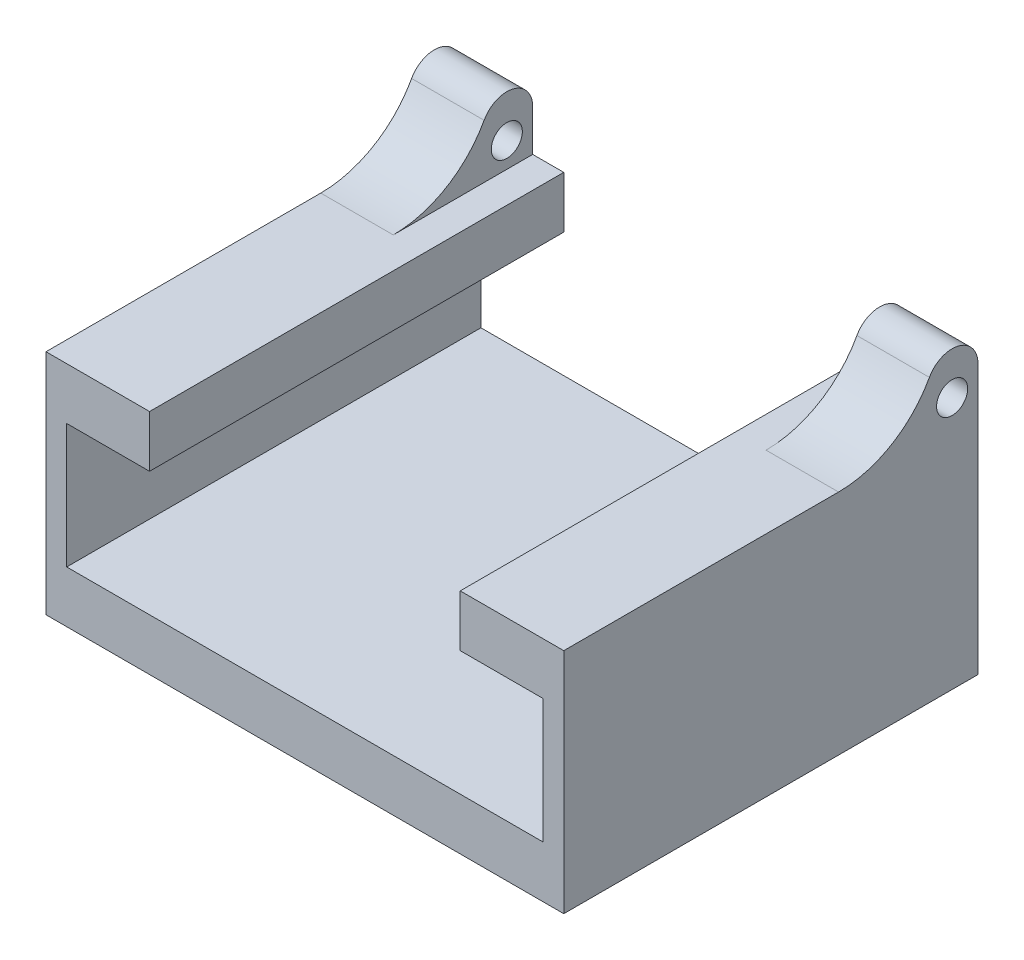
ISO-10303-21;
HEADER;
FILE_DESCRIPTION(('STEP AP214'),'2;1');
FILE_NAME('part.step','',(''),(''),'','','');
FILE_SCHEMA(('AUTOMOTIVE_DESIGN { 1 0 10303 214 1 1 1 1 }'));
ENDSEC;
DATA;
#1=APPLICATION_CONTEXT('core data for automotive mechanical design processes');
#2=APPLICATION_PROTOCOL_DEFINITION('international standard','automotive_design',2000,#1);
#3=PRODUCT_CONTEXT('',#1,'mechanical');
#4=PRODUCT('Part','Part','',(#3));
#5=PRODUCT_RELATED_PRODUCT_CATEGORY('part','',(#4));
#6=PRODUCT_DEFINITION_FORMATION('','',#4);
#7=PRODUCT_DEFINITION_CONTEXT('part definition',#1,'design');
#8=PRODUCT_DEFINITION('design','',#6,#7);
#9=PRODUCT_DEFINITION_SHAPE('','',#8);
#10=(LENGTH_UNIT() NAMED_UNIT(*) SI_UNIT(.MILLI.,.METRE.));
#11=(NAMED_UNIT(*) PLANE_ANGLE_UNIT() SI_UNIT($,.RADIAN.));
#12=(NAMED_UNIT(*) SI_UNIT($,.STERADIAN.) SOLID_ANGLE_UNIT());
#13=UNCERTAINTY_MEASURE_WITH_UNIT(LENGTH_MEASURE(1.E-05),#10,'distance_accuracy_value','');
#14=(GEOMETRIC_REPRESENTATION_CONTEXT(3) GLOBAL_UNCERTAINTY_ASSIGNED_CONTEXT((#13)) GLOBAL_UNIT_ASSIGNED_CONTEXT((#10,
#11,#12)) REPRESENTATION_CONTEXT('',''));
#15=CARTESIAN_POINT('',(0.,0.,0.));
#16=DIRECTION('',(0.,0.,1.));
#17=DIRECTION('',(1.,0.,0.));
#18=AXIS2_PLACEMENT_3D('',#15,#16,#17);
#19=CARTESIAN_POINT('',(0.,5.,0.));
#20=DIRECTION('',(0.,1.,0.));
#21=DIRECTION('',(0.,0.,1.));
#22=AXIS2_PLACEMENT_3D('',#19,#20,#21);
#23=PLANE('',#22);
#24=DIRECTION('',(1.,0.,0.));
#25=VECTOR('',#24,1.);
#26=CARTESIAN_POINT('',(0.,5.,0.));
#27=LINE('',#26,#25);
#28=CARTESIAN_POINT('',(2.,5.,0.));
#29=VERTEX_POINT('',#28);
#30=CARTESIAN_POINT('',(48.,5.,0.));
#31=VERTEX_POINT('',#30);
#32=EDGE_CURVE('E310',#29,#31,#27,.T.);
#33=ORIENTED_EDGE('',*,*,#32,.T.);
#34=DIRECTION('',(0.,0.,1.));
#35=VECTOR('',#34,1.);
#36=CARTESIAN_POINT('',(48.,5.,-40.));
#37=LINE('',#36,#35);
#38=CARTESIAN_POINT('',(48.,5.,-40.));
#39=VERTEX_POINT('',#38);
#40=EDGE_CURVE('E242',#39,#31,#37,.T.);
#41=ORIENTED_EDGE('',*,*,#40,.F.);
#42=DIRECTION('',(1.,0.,0.));
#43=VECTOR('',#42,1.);
#44=CARTESIAN_POINT('',(0.,5.,-40.));
#45=LINE('',#44,#43);
#46=CARTESIAN_POINT('',(2.,5.,-40.));
#47=VERTEX_POINT('',#46);
#48=EDGE_CURVE('E267',#47,#39,#45,.T.);
#49=ORIENTED_EDGE('',*,*,#48,.F.);
#50=DIRECTION('',(0.,0.,-1.));
#51=VECTOR('',#50,1.);
#52=CARTESIAN_POINT('',(2.,5.,-40.));
#53=LINE('',#52,#51);
#54=EDGE_CURVE('E254',#29,#47,#53,.T.);
#55=ORIENTED_EDGE('',*,*,#54,.F.);
#56=EDGE_LOOP('',(#33,#41,#49,#55));
#57=FACE_BOUND('',#56,.T.);
#58=ADVANCED_FACE('F33',(#57),#23,.T.);
#59=CARTESIAN_POINT('',(0.,5.,0.));
#60=DIRECTION('',(0.,0.,-1.));
#61=DIRECTION('',(-1.,0.,0.));
#62=AXIS2_PLACEMENT_3D('',#59,#60,#61);
#63=PLANE('',#62);
#64=DIRECTION('',(1.,0.,0.));
#65=VECTOR('',#64,1.);
#66=CARTESIAN_POINT('',(0.,0.,0.));
#67=LINE('',#66,#65);
#68=CARTESIAN_POINT('',(0.,0.,0.));
#69=VERTEX_POINT('',#68);
#70=CARTESIAN_POINT('',(50.,0.,0.));
#71=VERTEX_POINT('',#70);
#72=EDGE_CURVE('E276',#69,#71,#67,.T.);
#73=ORIENTED_EDGE('',*,*,#72,.T.);
#74=DIRECTION('',(0.,-1.,0.));
#75=VECTOR('',#74,1.);
#76=CARTESIAN_POINT('',(50.,5.,0.));
#77=LINE('',#76,#75);
#78=CARTESIAN_POINT('',(50.,22.,0.));
#79=VERTEX_POINT('',#78);
#80=EDGE_CURVE('E283',#79,#71,#77,.T.);
#81=ORIENTED_EDGE('',*,*,#80,.F.);
#82=DIRECTION('',(1.,0.,0.));
#83=VECTOR('',#82,1.);
#84=CARTESIAN_POINT('',(50.,22.,0.));
#85=LINE('',#84,#83);
#86=CARTESIAN_POINT('',(40.,22.,0.));
#87=VERTEX_POINT('',#86);
#88=EDGE_CURVE('E207',#87,#79,#85,.T.);
#89=ORIENTED_EDGE('',*,*,#88,.F.);
#90=DIRECTION('',(0.,-1.,0.));
#91=VECTOR('',#90,1.);
#92=CARTESIAN_POINT('',(40.,22.,0.));
#93=LINE('',#92,#91);
#94=CARTESIAN_POINT('',(40.,17.,0.));
#95=VERTEX_POINT('',#94);
#96=EDGE_CURVE('E210',#87,#95,#93,.T.);
#97=ORIENTED_EDGE('',*,*,#96,.T.);
#98=DIRECTION('',(1.,0.,0.));
#99=VECTOR('',#98,1.);
#100=CARTESIAN_POINT('',(50.,17.,0.));
#101=LINE('',#100,#99);
#102=CARTESIAN_POINT('',(48.,17.,0.));
#103=VERTEX_POINT('',#102);
#104=EDGE_CURVE('E203',#95,#103,#101,.T.);
#105=ORIENTED_EDGE('',*,*,#104,.T.);
#106=DIRECTION('',(0.,-1.,0.));
#107=VECTOR('',#106,1.);
#108=CARTESIAN_POINT('',(48.,17.,0.));
#109=LINE('',#108,#107);
#110=EDGE_CURVE('E246',#103,#31,#109,.T.);
#111=ORIENTED_EDGE('',*,*,#110,.T.);
#112=ORIENTED_EDGE('',*,*,#32,.F.);
#113=DIRECTION('',(0.,-1.,0.));
#114=VECTOR('',#113,1.);
#115=CARTESIAN_POINT('',(2.,17.,0.));
#116=LINE('',#115,#114);
#117=CARTESIAN_POINT('',(2.,17.,0.));
#118=VERTEX_POINT('',#117);
#119=EDGE_CURVE('E271',#118,#29,#116,.T.);
#120=ORIENTED_EDGE('',*,*,#119,.F.);
#121=DIRECTION('',(1.,0.,0.));
#122=VECTOR('',#121,1.);
#123=CARTESIAN_POINT('',(0.,17.,0.));
#124=LINE('',#123,#122);
#125=CARTESIAN_POINT('',(10.,17.,0.));
#126=VERTEX_POINT('',#125);
#127=EDGE_CURVE('E221',#118,#126,#124,.T.);
#128=ORIENTED_EDGE('',*,*,#127,.T.);
#129=DIRECTION('',(0.,-1.,0.));
#130=VECTOR('',#129,1.);
#131=CARTESIAN_POINT('',(10.,22.,0.));
#132=LINE('',#131,#130);
#133=CARTESIAN_POINT('',(10.,22.,0.));
#134=VERTEX_POINT('',#133);
#135=EDGE_CURVE('E239',#134,#126,#132,.T.);
#136=ORIENTED_EDGE('',*,*,#135,.F.);
#137=DIRECTION('',(1.,0.,0.));
#138=VECTOR('',#137,1.);
#139=CARTESIAN_POINT('',(0.,22.,0.));
#140=LINE('',#139,#138);
#141=CARTESIAN_POINT('',(0.,22.,0.));
#142=VERTEX_POINT('',#141);
#143=EDGE_CURVE('E224',#142,#134,#140,.T.);
#144=ORIENTED_EDGE('',*,*,#143,.F.);
#145=DIRECTION('',(0.,-1.,0.));
#146=VECTOR('',#145,1.);
#147=CARTESIAN_POINT('',(0.,5.,0.));
#148=LINE('',#147,#146);
#149=EDGE_CURVE('E307',#142,#69,#148,.T.);
#150=ORIENTED_EDGE('',*,*,#149,.T.);
#151=EDGE_LOOP('',(#73,#81,#89,#97,#105,#111,#112,#120,#128,#136,#144,#150));
#152=FACE_BOUND('',#151,.T.);
#153=ADVANCED_FACE('F327',(#152),#63,.F.);
#154=CARTESIAN_POINT('',(50.,5.,0.));
#155=DIRECTION('',(-1.,0.,0.));
#156=DIRECTION('',(0.,0.,1.));
#157=AXIS2_PLACEMENT_3D('',#154,#155,#156);
#158=PLANE('',#157);
#159=DIRECTION('',(0.,0.,-1.));
#160=VECTOR('',#159,1.);
#161=CARTESIAN_POINT('',(50.,0.,0.));
#162=LINE('',#161,#160);
#163=CARTESIAN_POINT('',(50.,0.,-40.));
#164=VERTEX_POINT('',#163);
#165=EDGE_CURVE('E302',#71,#164,#162,.T.);
#166=ORIENTED_EDGE('',*,*,#165,.T.);
#167=DIRECTION('',(0.,-1.,0.));
#168=VECTOR('',#167,1.);
#169=CARTESIAN_POINT('',(50.,5.,-40.));
#170=LINE('',#169,#168);
#171=CARTESIAN_POINT('',(50.,26.,-40.));
#172=VERTEX_POINT('',#171);
#173=EDGE_CURVE('E300',#172,#164,#170,.T.);
#174=ORIENTED_EDGE('',*,*,#173,.F.);
#175=CARTESIAN_POINT('',(50.,26.,-37.5));
#176=DIRECTION('',(1.,0.,0.));
#177=DIRECTION('',(0.,0.,1.));
#178=AXIS2_PLACEMENT_3D('',#175,#176,#177);
#179=CIRCLE('',#178,2.50000000000001);
#180=CARTESIAN_POINT('',(50.,27.2,-35.3068287800539));
#181=VERTEX_POINT('',#180);
#182=EDGE_CURVE('E165',#172,#181,#179,.T.);
#183=ORIENTED_EDGE('',*,*,#182,.T.);
#184=CARTESIAN_POINT('',(50.,32.,-26.5341439002693));
#185=DIRECTION('',(-1.,0.,0.));
#186=DIRECTION('',(0.,0.,1.));
#187=AXIS2_PLACEMENT_3D('',#184,#185,#186);
#188=CIRCLE('',#187,10.);
#189=CARTESIAN_POINT('',(50.,22.,-26.5341439002693));
#190=VERTEX_POINT('',#189);
#191=EDGE_CURVE('E41',#181,#190,#188,.T.);
#192=ORIENTED_EDGE('',*,*,#191,.T.);
#193=DIRECTION('',(0.,0.,-1.));
#194=VECTOR('',#193,1.);
#195=CARTESIAN_POINT('',(50.,22.,-40.));
#196=LINE('',#195,#194);
#197=EDGE_CURVE('E201',#79,#190,#196,.T.);
#198=ORIENTED_EDGE('',*,*,#197,.F.);
#199=ORIENTED_EDGE('',*,*,#80,.T.);
#200=EDGE_LOOP('',(#166,#174,#183,#192,#198,#199));
#201=FACE_BOUND('',#200,.T.);
#202=CARTESIAN_POINT('',(50.,24.4145925895514,-37.5));
#203=DIRECTION('',(1.,0.,0.));
#204=DIRECTION('',(0.,0.,-1.));
#205=AXIS2_PLACEMENT_3D('',#202,#203,#204);
#206=CIRCLE('',#205,1.5);
#207=CARTESIAN_POINT('',(50.,24.4145925895514,-39.));
#208=VERTEX_POINT('',#207);
#209=EDGE_CURVE('E610',#208,#208,#206,.T.);
#210=ORIENTED_EDGE('',*,*,#209,.F.);
#211=EDGE_LOOP('',(#210));
#212=FACE_BOUND('',#211,.T.);
#213=ADVANCED_FACE('F298',(#201,#212),#158,.F.);
#214=CARTESIAN_POINT('',(0.,5.,-40.));
#215=DIRECTION('',(0.,0.,-1.));
#216=DIRECTION('',(-1.,0.,0.));
#217=AXIS2_PLACEMENT_3D('',#214,#215,#216);
#218=PLANE('',#217);
#219=DIRECTION('',(1.,0.,0.));
#220=VECTOR('',#219,1.);
#221=CARTESIAN_POINT('',(0.,0.,-40.));
#222=LINE('',#221,#220);
#223=CARTESIAN_POINT('',(0.,0.,-40.));
#224=VERTEX_POINT('',#223);
#225=EDGE_CURVE('E316',#224,#164,#222,.T.);
#226=ORIENTED_EDGE('',*,*,#225,.F.);
#227=DIRECTION('',(0.,-1.,0.));
#228=VECTOR('',#227,1.);
#229=CARTESIAN_POINT('',(0.,5.,-40.));
#230=LINE('',#229,#228);
#231=CARTESIAN_POINT('',(0.,26.,-40.));
#232=VERTEX_POINT('',#231);
#233=EDGE_CURVE('E304',#232,#224,#230,.T.);
#234=ORIENTED_EDGE('',*,*,#233,.F.);
#235=DIRECTION('',(-1.,0.,0.));
#236=VECTOR('',#235,1.);
#237=CARTESIAN_POINT('',(7.,26.,-40.));
#238=LINE('',#237,#236);
#239=CARTESIAN_POINT('',(7.,26.,-40.));
#240=VERTEX_POINT('',#239);
#241=EDGE_CURVE('E196',#240,#232,#238,.T.);
#242=ORIENTED_EDGE('',*,*,#241,.F.);
#243=DIRECTION('',(0.,-1.,0.));
#244=VECTOR('',#243,1.);
#245=CARTESIAN_POINT('',(7.,22.,-40.));
#246=LINE('',#245,#244);
#247=CARTESIAN_POINT('',(7.,22.,-40.));
#248=VERTEX_POINT('',#247);
#249=EDGE_CURVE('E189',#240,#248,#246,.T.);
#250=ORIENTED_EDGE('',*,*,#249,.T.);
#251=DIRECTION('',(-1.,0.,0.));
#252=VECTOR('',#251,1.);
#253=CARTESIAN_POINT('',(0.,22.,-40.));
#254=LINE('',#253,#252);
#255=CARTESIAN_POINT('',(10.,22.,-40.));
#256=VERTEX_POINT('',#255);
#257=EDGE_CURVE('E229',#256,#248,#254,.T.);
#258=ORIENTED_EDGE('',*,*,#257,.F.);
#259=DIRECTION('',(0.,-1.,0.));
#260=VECTOR('',#259,1.);
#261=CARTESIAN_POINT('',(10.,22.,-40.));
#262=LINE('',#261,#260);
#263=CARTESIAN_POINT('',(10.,17.,-40.));
#264=VERTEX_POINT('',#263);
#265=EDGE_CURVE('E231',#256,#264,#262,.T.);
#266=ORIENTED_EDGE('',*,*,#265,.T.);
#267=DIRECTION('',(-1.,0.,0.));
#268=VECTOR('',#267,1.);
#269=CARTESIAN_POINT('',(0.,17.,-40.));
#270=LINE('',#269,#268);
#271=CARTESIAN_POINT('',(2.,17.,-40.));
#272=VERTEX_POINT('',#271);
#273=EDGE_CURVE('E225',#264,#272,#270,.T.);
#274=ORIENTED_EDGE('',*,*,#273,.T.);
#275=DIRECTION('',(0.,-1.,0.));
#276=VECTOR('',#275,1.);
#277=CARTESIAN_POINT('',(2.,17.,-40.));
#278=LINE('',#277,#276);
#279=EDGE_CURVE('E258',#272,#47,#278,.T.);
#280=ORIENTED_EDGE('',*,*,#279,.T.);
#281=ORIENTED_EDGE('',*,*,#48,.T.);
#282=DIRECTION('',(0.,-1.,0.));
#283=VECTOR('',#282,1.);
#284=CARTESIAN_POINT('',(48.,17.,-40.));
#285=LINE('',#284,#283);
#286=CARTESIAN_POINT('',(48.,17.,-40.));
#287=VERTEX_POINT('',#286);
#288=EDGE_CURVE('E251',#287,#39,#285,.T.);
#289=ORIENTED_EDGE('',*,*,#288,.F.);
#290=DIRECTION('',(-1.,0.,0.));
#291=VECTOR('',#290,1.);
#292=CARTESIAN_POINT('',(50.,17.,-40.));
#293=LINE('',#292,#291);
#294=CARTESIAN_POINT('',(40.,17.,-40.));
#295=VERTEX_POINT('',#294);
#296=EDGE_CURVE('E200',#287,#295,#293,.T.);
#297=ORIENTED_EDGE('',*,*,#296,.T.);
#298=DIRECTION('',(0.,-1.,0.));
#299=VECTOR('',#298,1.);
#300=CARTESIAN_POINT('',(40.,22.,-40.));
#301=LINE('',#300,#299);
#302=CARTESIAN_POINT('',(40.,22.,-40.));
#303=VERTEX_POINT('',#302);
#304=EDGE_CURVE('E218',#303,#295,#301,.T.);
#305=ORIENTED_EDGE('',*,*,#304,.F.);
#306=DIRECTION('',(-1.,0.,0.));
#307=VECTOR('',#306,1.);
#308=CARTESIAN_POINT('',(50.,22.,-40.));
#309=LINE('',#308,#307);
#310=CARTESIAN_POINT('',(43.,22.,-40.));
#311=VERTEX_POINT('',#310);
#312=EDGE_CURVE('E174',#311,#303,#309,.T.);
#313=ORIENTED_EDGE('',*,*,#312,.F.);
#314=DIRECTION('',(0.,1.,0.));
#315=VECTOR('',#314,1.);
#316=CARTESIAN_POINT('',(43.,22.,-40.));
#317=LINE('',#316,#315);
#318=CARTESIAN_POINT('',(43.,26.,-40.));
#319=VERTEX_POINT('',#318);
#320=EDGE_CURVE('E170',#311,#319,#317,.T.);
#321=ORIENTED_EDGE('',*,*,#320,.T.);
#322=DIRECTION('',(1.,0.,0.));
#323=VECTOR('',#322,1.);
#324=CARTESIAN_POINT('',(43.,26.,-40.));
#325=LINE('',#324,#323);
#326=EDGE_CURVE('E158',#319,#172,#325,.T.);
#327=ORIENTED_EDGE('',*,*,#326,.T.);
#328=ORIENTED_EDGE('',*,*,#173,.T.);
#329=EDGE_LOOP('',(#226,#234,#242,#250,#258,#266,#274,#280,#281,#289,#297,#305,#313,#321,#327,#328));
#330=FACE_BOUND('',#329,.T.);
#331=ADVANCED_FACE('F172',(#330),#218,.T.);
#332=CARTESIAN_POINT('',(0.,5.,0.));
#333=DIRECTION('',(-1.,0.,0.));
#334=DIRECTION('',(0.,0.,1.));
#335=AXIS2_PLACEMENT_3D('',#332,#333,#334);
#336=PLANE('',#335);
#337=DIRECTION('',(0.,0.,-1.));
#338=VECTOR('',#337,1.);
#339=CARTESIAN_POINT('',(0.,0.,0.));
#340=LINE('',#339,#338);
#341=EDGE_CURVE('E311',#69,#224,#340,.T.);
#342=ORIENTED_EDGE('',*,*,#341,.F.);
#343=ORIENTED_EDGE('',*,*,#149,.F.);
#344=DIRECTION('',(0.,0.,1.));
#345=VECTOR('',#344,1.);
#346=CARTESIAN_POINT('',(0.,22.,-40.));
#347=LINE('',#346,#345);
#348=CARTESIAN_POINT('',(0.,22.,-26.5341439002694));
#349=VERTEX_POINT('',#348);
#350=EDGE_CURVE('E222',#349,#142,#347,.T.);
#351=ORIENTED_EDGE('',*,*,#350,.F.);
#352=CARTESIAN_POINT('',(0.,32.,-26.5341439002694));
#353=DIRECTION('',(-1.,0.,0.));
#354=DIRECTION('',(0.,0.,1.));
#355=AXIS2_PLACEMENT_3D('',#352,#353,#354);
#356=CIRCLE('',#355,10.);
#357=CARTESIAN_POINT('',(0.,27.2,-35.3068287800539));
#358=VERTEX_POINT('',#357);
#359=EDGE_CURVE('E285',#349,#358,#356,.F.);
#360=ORIENTED_EDGE('',*,*,#359,.T.);
#361=CARTESIAN_POINT('',(0.,26.,-37.5));
#362=DIRECTION('',(-1.,0.,0.));
#363=DIRECTION('',(0.,0.,-1.));
#364=AXIS2_PLACEMENT_3D('',#361,#362,#363);
#365=CIRCLE('',#364,2.5);
#366=EDGE_CURVE('E186',#358,#232,#365,.T.);
#367=ORIENTED_EDGE('',*,*,#366,.T.);
#368=ORIENTED_EDGE('',*,*,#233,.T.);
#369=EDGE_LOOP('',(#342,#343,#351,#360,#367,#368));
#370=FACE_BOUND('',#369,.T.);
#371=CARTESIAN_POINT('',(0.,24.4145925895514,-37.5));
#372=DIRECTION('',(-1.,0.,0.));
#373=DIRECTION('',(0.,0.,1.));
#374=AXIS2_PLACEMENT_3D('',#371,#372,#373);
#375=CIRCLE('',#374,1.5);
#376=CARTESIAN_POINT('',(0.,24.4145925895514,-36.));
#377=VERTEX_POINT('',#376);
#378=EDGE_CURVE('E167',#377,#377,#375,.T.);
#379=ORIENTED_EDGE('',*,*,#378,.F.);
#380=EDGE_LOOP('',(#379));
#381=FACE_BOUND('',#380,.T.);
#382=ADVANCED_FACE('F333',(#370,#381),#336,.T.);
#383=CARTESIAN_POINT('',(0.,0.,0.));
#384=DIRECTION('',(0.,1.,0.));
#385=DIRECTION('',(0.,0.,1.));
#386=AXIS2_PLACEMENT_3D('',#383,#384,#385);
#387=PLANE('',#386);
#388=ORIENTED_EDGE('',*,*,#72,.F.);
#389=ORIENTED_EDGE('',*,*,#341,.T.);
#390=ORIENTED_EDGE('',*,*,#225,.T.);
#391=ORIENTED_EDGE('',*,*,#165,.F.);
#392=EDGE_LOOP('',(#388,#389,#390,#391));
#393=FACE_BOUND('',#392,.T.);
#394=ADVANCED_FACE('F331',(#393),#387,.F.);
#395=CARTESIAN_POINT('',(2.,17.,-40.));
#396=DIRECTION('',(-1.,0.,0.));
#397=DIRECTION('',(0.,0.,1.));
#398=AXIS2_PLACEMENT_3D('',#395,#396,#397);
#399=PLANE('',#398);
#400=ORIENTED_EDGE('',*,*,#54,.T.);
#401=ORIENTED_EDGE('',*,*,#279,.F.);
#402=DIRECTION('',(0.,0.,-1.));
#403=VECTOR('',#402,1.);
#404=CARTESIAN_POINT('',(2.,17.,-40.));
#405=LINE('',#404,#403);
#406=EDGE_CURVE('E255',#118,#272,#405,.T.);
#407=ORIENTED_EDGE('',*,*,#406,.F.);
#408=ORIENTED_EDGE('',*,*,#119,.T.);
#409=EDGE_LOOP('',(#400,#401,#407,#408));
#410=FACE_BOUND('',#409,.T.);
#411=ADVANCED_FACE('F363',(#410),#399,.F.);
#412=CARTESIAN_POINT('',(48.,17.,-40.));
#413=DIRECTION('',(1.,0.,0.));
#414=DIRECTION('',(0.,0.,-1.));
#415=AXIS2_PLACEMENT_3D('',#412,#413,#414);
#416=PLANE('',#415);
#417=ORIENTED_EDGE('',*,*,#40,.T.);
#418=ORIENTED_EDGE('',*,*,#110,.F.);
#419=DIRECTION('',(0.,0.,1.));
#420=VECTOR('',#419,1.);
#421=CARTESIAN_POINT('',(48.,17.,-40.));
#422=LINE('',#421,#420);
#423=EDGE_CURVE('E243',#287,#103,#422,.T.);
#424=ORIENTED_EDGE('',*,*,#423,.F.);
#425=ORIENTED_EDGE('',*,*,#288,.T.);
#426=EDGE_LOOP('',(#417,#418,#424,#425));
#427=FACE_BOUND('',#426,.T.);
#428=ADVANCED_FACE('F366',(#427),#416,.F.);
#429=CARTESIAN_POINT('',(0.,17.,0.));
#430=DIRECTION('',(0.,1.,0.));
#431=DIRECTION('',(0.,0.,1.));
#432=AXIS2_PLACEMENT_3D('',#429,#430,#431);
#433=PLANE('',#432);
#434=ORIENTED_EDGE('',*,*,#127,.F.);
#435=ORIENTED_EDGE('',*,*,#406,.T.);
#436=ORIENTED_EDGE('',*,*,#273,.F.);
#437=DIRECTION('',(0.,0.,-1.));
#438=VECTOR('',#437,1.);
#439=CARTESIAN_POINT('',(10.,17.,-40.));
#440=LINE('',#439,#438);
#441=EDGE_CURVE('E233',#126,#264,#440,.T.);
#442=ORIENTED_EDGE('',*,*,#441,.F.);
#443=EDGE_LOOP('',(#434,#435,#436,#442));
#444=FACE_BOUND('',#443,.T.);
#445=ADVANCED_FACE('F360',(#444),#433,.F.);
#446=CARTESIAN_POINT('',(10.,22.,-40.));
#447=DIRECTION('',(-1.,0.,0.));
#448=DIRECTION('',(0.,0.,1.));
#449=AXIS2_PLACEMENT_3D('',#446,#447,#448);
#450=PLANE('',#449);
#451=ORIENTED_EDGE('',*,*,#441,.T.);
#452=ORIENTED_EDGE('',*,*,#265,.F.);
#453=DIRECTION('',(0.,0.,-1.));
#454=VECTOR('',#453,1.);
#455=CARTESIAN_POINT('',(10.,22.,-40.));
#456=LINE('',#455,#454);
#457=EDGE_CURVE('E227',#134,#256,#456,.T.);
#458=ORIENTED_EDGE('',*,*,#457,.F.);
#459=ORIENTED_EDGE('',*,*,#135,.T.);
#460=EDGE_LOOP('',(#451,#452,#458,#459));
#461=FACE_BOUND('',#460,.T.);
#462=ADVANCED_FACE('F377',(#461),#450,.F.);
#463=CARTESIAN_POINT('',(0.,22.,0.));
#464=DIRECTION('',(0.,1.,0.));
#465=DIRECTION('',(0.,0.,1.));
#466=AXIS2_PLACEMENT_3D('',#463,#464,#465);
#467=PLANE('',#466);
#468=DIRECTION('',(0.,0.,1.));
#469=VECTOR('',#468,1.);
#470=CARTESIAN_POINT('',(7.,22.,-40.));
#471=LINE('',#470,#469);
#472=CARTESIAN_POINT('',(7.,22.,-26.5341439002694));
#473=VERTEX_POINT('',#472);
#474=EDGE_CURVE('E192',#248,#473,#471,.T.);
#475=ORIENTED_EDGE('',*,*,#474,.T.);
#476=DIRECTION('',(1.,0.,0.));
#477=VECTOR('',#476,1.);
#478=CARTESIAN_POINT('',(0.,22.,-26.5341439002694));
#479=LINE('',#478,#477);
#480=EDGE_CURVE('E279',#473,#349,#479,.F.);
#481=ORIENTED_EDGE('',*,*,#480,.T.);
#482=ORIENTED_EDGE('',*,*,#350,.T.);
#483=ORIENTED_EDGE('',*,*,#143,.T.);
#484=ORIENTED_EDGE('',*,*,#457,.T.);
#485=ORIENTED_EDGE('',*,*,#257,.T.);
#486=EDGE_LOOP('',(#475,#481,#482,#483,#484,#485));
#487=FACE_BOUND('',#486,.T.);
#488=ADVANCED_FACE('F351',(#487),#467,.T.);
#489=CARTESIAN_POINT('',(0.,17.,0.));
#490=DIRECTION('',(0.,-1.,0.));
#491=DIRECTION('',(0.,0.,-1.));
#492=AXIS2_PLACEMENT_3D('',#489,#490,#491);
#493=PLANE('',#492);
#494=ORIENTED_EDGE('',*,*,#423,.T.);
#495=ORIENTED_EDGE('',*,*,#104,.F.);
#496=DIRECTION('',(0.,0.,1.));
#497=VECTOR('',#496,1.);
#498=CARTESIAN_POINT('',(40.,17.,-40.));
#499=LINE('',#498,#497);
#500=EDGE_CURVE('E212',#295,#95,#499,.T.);
#501=ORIENTED_EDGE('',*,*,#500,.F.);
#502=ORIENTED_EDGE('',*,*,#296,.F.);
#503=EDGE_LOOP('',(#494,#495,#501,#502));
#504=FACE_BOUND('',#503,.T.);
#505=ADVANCED_FACE('F371',(#504),#493,.T.);
#506=CARTESIAN_POINT('',(40.,22.,-40.));
#507=DIRECTION('',(1.,0.,0.));
#508=DIRECTION('',(0.,0.,-1.));
#509=AXIS2_PLACEMENT_3D('',#506,#507,#508);
#510=PLANE('',#509);
#511=ORIENTED_EDGE('',*,*,#500,.T.);
#512=ORIENTED_EDGE('',*,*,#96,.F.);
#513=DIRECTION('',(0.,0.,1.));
#514=VECTOR('',#513,1.);
#515=CARTESIAN_POINT('',(40.,22.,-40.));
#516=LINE('',#515,#514);
#517=EDGE_CURVE('E205',#303,#87,#516,.T.);
#518=ORIENTED_EDGE('',*,*,#517,.F.);
#519=ORIENTED_EDGE('',*,*,#304,.T.);
#520=EDGE_LOOP('',(#511,#512,#518,#519));
#521=FACE_BOUND('',#520,.T.);
#522=ADVANCED_FACE('F374',(#521),#510,.F.);
#523=CARTESIAN_POINT('',(0.,22.,0.));
#524=DIRECTION('',(0.,-1.,0.));
#525=DIRECTION('',(0.,0.,-1.));
#526=AXIS2_PLACEMENT_3D('',#523,#524,#525);
#527=PLANE('',#526);
#528=ORIENTED_EDGE('',*,*,#197,.T.);
#529=DIRECTION('',(1.,0.,0.));
#530=VECTOR('',#529,1.);
#531=CARTESIAN_POINT('',(0.,22.,-26.5341439002693));
#532=LINE('',#531,#530);
#533=CARTESIAN_POINT('',(43.,22.,-26.5341439002693));
#534=VERTEX_POINT('',#533);
#535=EDGE_CURVE('E292',#190,#534,#532,.F.);
#536=ORIENTED_EDGE('',*,*,#535,.T.);
#537=DIRECTION('',(0.,0.,-1.));
#538=VECTOR('',#537,1.);
#539=CARTESIAN_POINT('',(43.,22.,-35.));
#540=LINE('',#539,#538);
#541=EDGE_CURVE('E47',#534,#311,#540,.T.);
#542=ORIENTED_EDGE('',*,*,#541,.T.);
#543=ORIENTED_EDGE('',*,*,#312,.T.);
#544=ORIENTED_EDGE('',*,*,#517,.T.);
#545=ORIENTED_EDGE('',*,*,#88,.T.);
#546=EDGE_LOOP('',(#528,#536,#542,#543,#544,#545));
#547=FACE_BOUND('',#546,.T.);
#548=ADVANCED_FACE('F295',(#547),#527,.F.);
#549=CARTESIAN_POINT('',(7.,26.,-37.5));
#550=DIRECTION('',(-1.,0.,0.));
#551=DIRECTION('',(0.,0.,1.));
#552=AXIS2_PLACEMENT_3D('',#549,#550,#551);
#553=CYLINDRICAL_SURFACE('',#552,2.5);
#554=ORIENTED_EDGE('',*,*,#366,.F.);
#555=DIRECTION('',(-1.,0.,0.));
#556=VECTOR('',#555,1.);
#557=CARTESIAN_POINT('',(7.,27.2,-35.3068287800539));
#558=LINE('',#557,#556);
#559=CARTESIAN_POINT('',(7.,27.2,-35.3068287800539));
#560=VERTEX_POINT('',#559);
#561=EDGE_CURVE('E282',#358,#560,#558,.F.);
#562=ORIENTED_EDGE('',*,*,#561,.T.);
#563=CARTESIAN_POINT('',(7.,26.,-37.5));
#564=DIRECTION('',(-1.,0.,0.));
#565=DIRECTION('',(0.,0.,-1.));
#566=AXIS2_PLACEMENT_3D('',#563,#564,#565);
#567=CIRCLE('',#566,2.5);
#568=EDGE_CURVE('E194',#560,#240,#567,.T.);
#569=ORIENTED_EDGE('',*,*,#568,.T.);
#570=ORIENTED_EDGE('',*,*,#241,.T.);
#571=EDGE_LOOP('',(#554,#562,#569,#570));
#572=FACE_BOUND('',#571,.T.);
#573=ADVANCED_FACE('F340',(#572),#553,.T.);
#574=CARTESIAN_POINT('',(7.,26.,-37.5));
#575=DIRECTION('',(1.,0.,0.));
#576=DIRECTION('',(0.,0.,-1.));
#577=AXIS2_PLACEMENT_3D('',#574,#575,#576);
#578=PLANE('',#577);
#579=CARTESIAN_POINT('',(7.,24.4145925895514,-37.5));
#580=DIRECTION('',(-1.,0.,0.));
#581=DIRECTION('',(0.,0.,1.));
#582=AXIS2_PLACEMENT_3D('',#579,#580,#581);
#583=CIRCLE('',#582,1.5);
#584=CARTESIAN_POINT('',(7.,24.4145925895514,-36.));
#585=VERTEX_POINT('',#584);
#586=EDGE_CURVE('E183',#585,#585,#583,.T.);
#587=ORIENTED_EDGE('',*,*,#586,.T.);
#588=EDGE_LOOP('',(#587));
#589=FACE_BOUND('',#588,.T.);
#590=ORIENTED_EDGE('',*,*,#249,.F.);
#591=ORIENTED_EDGE('',*,*,#568,.F.);
#592=CARTESIAN_POINT('',(7.,32.,-26.5341439002694));
#593=DIRECTION('',(1.,0.,0.));
#594=DIRECTION('',(0.,0.,-1.));
#595=AXIS2_PLACEMENT_3D('',#592,#593,#594);
#596=CIRCLE('',#595,10.);
#597=EDGE_CURVE('E287',#560,#473,#596,.F.);
#598=ORIENTED_EDGE('',*,*,#597,.T.);
#599=ORIENTED_EDGE('',*,*,#474,.F.);
#600=EDGE_LOOP('',(#590,#591,#598,#599));
#601=FACE_BOUND('',#600,.T.);
#602=ADVANCED_FACE('F345',(#589,#601),#578,.T.);
#603=CARTESIAN_POINT('',(7.,24.4145925895514,-37.5));
#604=DIRECTION('',(-1.,0.,0.));
#605=DIRECTION('',(0.,0.,1.));
#606=AXIS2_PLACEMENT_3D('',#603,#604,#605);
#607=CYLINDRICAL_SURFACE('',#606,1.5);
#608=ORIENTED_EDGE('',*,*,#586,.F.);
#609=EDGE_LOOP('',(#608));
#610=FACE_BOUND('',#609,.T.);
#611=ORIENTED_EDGE('',*,*,#378,.T.);
#612=EDGE_LOOP('',(#611));
#613=FACE_BOUND('',#612,.T.);
#614=ADVANCED_FACE('F403',(#610,#613),#607,.F.);
#615=CARTESIAN_POINT('',(7.,32.,-26.5341439002694));
#616=DIRECTION('',(-1.,0.,0.));
#617=DIRECTION('',(0.,0.,1.));
#618=AXIS2_PLACEMENT_3D('',#615,#616,#617);
#619=CYLINDRICAL_SURFACE('',#618,10.);
#620=ORIENTED_EDGE('',*,*,#597,.F.);
#621=ORIENTED_EDGE('',*,*,#561,.F.);
#622=ORIENTED_EDGE('',*,*,#359,.F.);
#623=ORIENTED_EDGE('',*,*,#480,.F.);
#624=EDGE_LOOP('',(#620,#621,#622,#623));
#625=FACE_BOUND('',#624,.T.);
#626=ADVANCED_FACE('F349',(#625),#619,.F.);
#627=CARTESIAN_POINT('',(43.,26.,-37.5));
#628=DIRECTION('',(1.,0.,0.));
#629=DIRECTION('',(0.,0.,-1.));
#630=AXIS2_PLACEMENT_3D('',#627,#628,#629);
#631=CYLINDRICAL_SURFACE('',#630,2.50000000000001);
#632=CARTESIAN_POINT('',(43.,26.,-37.5));
#633=DIRECTION('',(1.,0.,0.));
#634=DIRECTION('',(0.,0.,1.));
#635=AXIS2_PLACEMENT_3D('',#632,#633,#634);
#636=CIRCLE('',#635,2.50000000000001);
#637=CARTESIAN_POINT('',(43.,27.2,-35.3068287800539));
#638=VERTEX_POINT('',#637);
#639=EDGE_CURVE('E163',#319,#638,#636,.T.);
#640=ORIENTED_EDGE('',*,*,#639,.T.);
#641=DIRECTION('',(1.,0.,0.));
#642=VECTOR('',#641,1.);
#643=CARTESIAN_POINT('',(43.,27.2,-35.3068287800539));
#644=LINE('',#643,#642);
#645=EDGE_CURVE('E290',#638,#181,#644,.T.);
#646=ORIENTED_EDGE('',*,*,#645,.T.);
#647=ORIENTED_EDGE('',*,*,#182,.F.);
#648=ORIENTED_EDGE('',*,*,#326,.F.);
#649=EDGE_LOOP('',(#640,#646,#647,#648));
#650=FACE_BOUND('',#649,.T.);
#651=ADVANCED_FACE('F160',(#650),#631,.T.);
#652=CARTESIAN_POINT('',(43.,26.,-37.5));
#653=DIRECTION('',(-1.,0.,0.));
#654=DIRECTION('',(0.,0.,1.));
#655=AXIS2_PLACEMENT_3D('',#652,#653,#654);
#656=PLANE('',#655);
#657=CARTESIAN_POINT('',(43.,24.4145925895514,-37.5));
#658=DIRECTION('',(1.,0.,0.));
#659=DIRECTION('',(0.,0.,-1.));
#660=AXIS2_PLACEMENT_3D('',#657,#658,#659);
#661=CIRCLE('',#660,1.5);
#662=CARTESIAN_POINT('',(43.,24.4145925895514,-39.));
#663=VERTEX_POINT('',#662);
#664=EDGE_CURVE('E181',#663,#663,#661,.T.);
#665=ORIENTED_EDGE('',*,*,#664,.T.);
#666=EDGE_LOOP('',(#665));
#667=FACE_BOUND('',#666,.T.);
#668=ORIENTED_EDGE('',*,*,#541,.F.);
#669=CARTESIAN_POINT('',(43.,32.,-26.5341439002693));
#670=DIRECTION('',(-1.,0.,0.));
#671=DIRECTION('',(0.,0.,1.));
#672=AXIS2_PLACEMENT_3D('',#669,#670,#671);
#673=CIRCLE('',#672,10.);
#674=EDGE_CURVE('E11',#534,#638,#673,.F.);
#675=ORIENTED_EDGE('',*,*,#674,.T.);
#676=ORIENTED_EDGE('',*,*,#639,.F.);
#677=ORIENTED_EDGE('',*,*,#320,.F.);
#678=EDGE_LOOP('',(#668,#675,#676,#677));
#679=FACE_BOUND('',#678,.T.);
#680=ADVANCED_FACE('F176',(#667,#679),#656,.T.);
#681=CARTESIAN_POINT('',(43.,24.4145925895514,-37.5));
#682=DIRECTION('',(1.,0.,0.));
#683=DIRECTION('',(0.,0.,-1.));
#684=AXIS2_PLACEMENT_3D('',#681,#682,#683);
#685=CYLINDRICAL_SURFACE('',#684,1.5);
#686=ORIENTED_EDGE('',*,*,#664,.F.);
#687=EDGE_LOOP('',(#686));
#688=FACE_BOUND('',#687,.T.);
#689=ORIENTED_EDGE('',*,*,#209,.T.);
#690=EDGE_LOOP('',(#689));
#691=FACE_BOUND('',#690,.T.);
#692=ADVANCED_FACE('F465',(#688,#691),#685,.F.);
#693=CARTESIAN_POINT('',(43.,32.,-26.5341439002693));
#694=DIRECTION('',(1.,0.,0.));
#695=DIRECTION('',(0.,0.,-1.));
#696=AXIS2_PLACEMENT_3D('',#693,#694,#695);
#697=CYLINDRICAL_SURFACE('',#696,10.);
#698=ORIENTED_EDGE('',*,*,#674,.F.);
#699=ORIENTED_EDGE('',*,*,#535,.F.);
#700=ORIENTED_EDGE('',*,*,#191,.F.);
#701=ORIENTED_EDGE('',*,*,#645,.F.);
#702=EDGE_LOOP('',(#698,#699,#700,#701));
#703=FACE_BOUND('',#702,.T.);
#704=ADVANCED_FACE('F35',(#703),#697,.F.);
#705=CLOSED_SHELL('',(#58,#153,#213,#331,#382,#394,#411,#428,#445,#462,#488,#505,#522,#548,#573,
#602,#614,#626,#651,#680,#692,#704));
#706=MANIFOLD_SOLID_BREP('B2',#705);
#707=ADVANCED_BREP_SHAPE_REPRESENTATION('',(#18,#706),#14);
#708=SHAPE_DEFINITION_REPRESENTATION(#9,#707);
ENDSEC;
END-ISO-10303-21;
